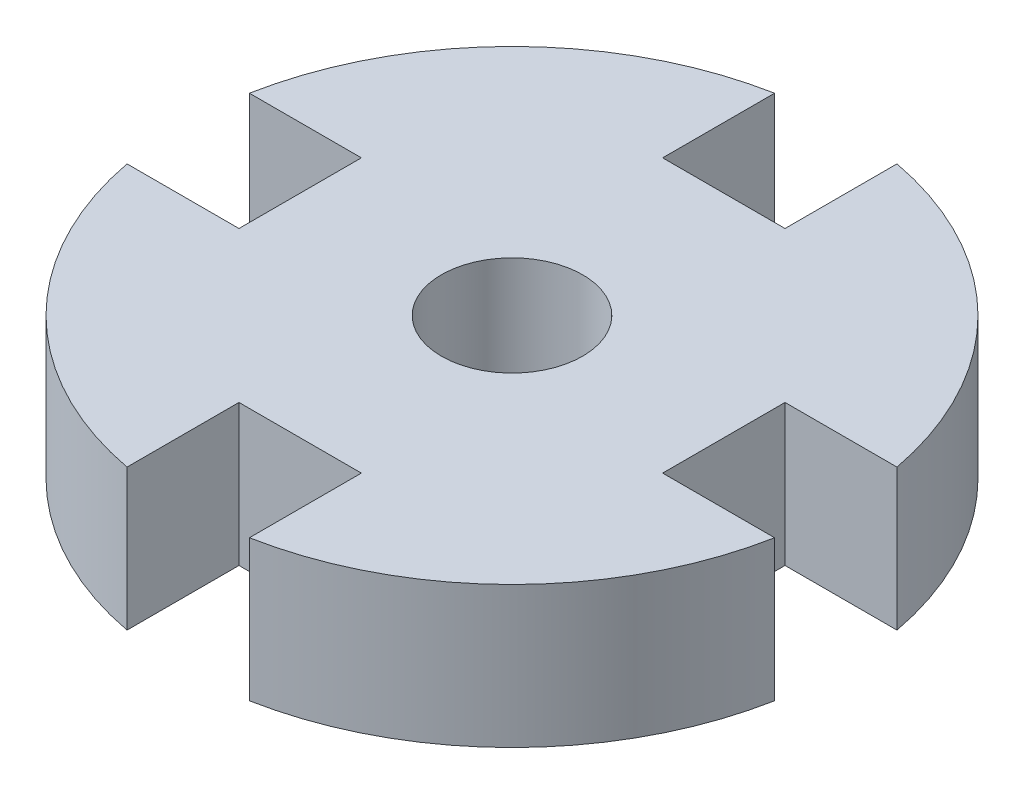
ISO-10303-21;
HEADER;
FILE_DESCRIPTION(('STEP AP214'),'2;1');
FILE_NAME('part.step','',(''),(''),'','','');
FILE_SCHEMA(('AUTOMOTIVE_DESIGN { 1 0 10303 214 1 1 1 1 }'));
ENDSEC;
DATA;
#1=APPLICATION_CONTEXT('core data for automotive mechanical design processes');
#2=APPLICATION_PROTOCOL_DEFINITION('international standard','automotive_design',2000,#1);
#3=PRODUCT_CONTEXT('',#1,'mechanical');
#4=PRODUCT('Part','Part','',(#3));
#5=PRODUCT_RELATED_PRODUCT_CATEGORY('part','',(#4));
#6=PRODUCT_DEFINITION_FORMATION('','',#4);
#7=PRODUCT_DEFINITION_CONTEXT('part definition',#1,'design');
#8=PRODUCT_DEFINITION('design','',#6,#7);
#9=PRODUCT_DEFINITION_SHAPE('','',#8);
#10=(LENGTH_UNIT() NAMED_UNIT(*) SI_UNIT(.MILLI.,.METRE.));
#11=(NAMED_UNIT(*) PLANE_ANGLE_UNIT() SI_UNIT($,.RADIAN.));
#12=(NAMED_UNIT(*) SI_UNIT($,.STERADIAN.) SOLID_ANGLE_UNIT());
#13=UNCERTAINTY_MEASURE_WITH_UNIT(LENGTH_MEASURE(1.E-05),#10,'distance_accuracy_value','');
#14=(GEOMETRIC_REPRESENTATION_CONTEXT(3) GLOBAL_UNCERTAINTY_ASSIGNED_CONTEXT((#13)) GLOBAL_UNIT_ASSIGNED_CONTEXT((#10,
#11,#12)) REPRESENTATION_CONTEXT('',''));
#15=CARTESIAN_POINT('',(0.,0.,0.));
#16=DIRECTION('',(0.,0.,1.));
#17=DIRECTION('',(1.,0.,0.));
#18=AXIS2_PLACEMENT_3D('',#15,#16,#17);
#19=CARTESIAN_POINT('',(0.,-1.5,0.));
#20=DIRECTION('',(0.,1.,0.));
#21=DIRECTION('',(0.,0.,1.));
#22=AXIS2_PLACEMENT_3D('',#19,#20,#21);
#23=CYLINDRICAL_SURFACE('',#22,7.);
#24=DIRECTION('',(0.,1.,0.));
#25=VECTOR('',#24,1.);
#26=CARTESIAN_POINT('',(1.29999999999998,-1.5,6.87822651560706));
#27=LINE('',#26,#25);
#28=CARTESIAN_POINT('',(1.29999999999998,-1.5,6.87822651560706));
#29=VERTEX_POINT('',#28);
#30=CARTESIAN_POINT('',(1.29999999999998,1.5,6.87822651560706));
#31=VERTEX_POINT('',#30);
#32=EDGE_CURVE('E218',#29,#31,#27,.T.);
#33=ORIENTED_EDGE('',*,*,#32,.F.);
#34=CARTESIAN_POINT('',(0.,-1.5,0.));
#35=DIRECTION('',(0.,1.,0.));
#36=DIRECTION('',(0.,0.,1.));
#37=AXIS2_PLACEMENT_3D('',#34,#35,#36);
#38=CIRCLE('',#37,7.);
#39=CARTESIAN_POINT('',(6.87822651560706,-1.5,1.3));
#40=VERTEX_POINT('',#39);
#41=EDGE_CURVE('E256',#29,#40,#38,.T.);
#42=ORIENTED_EDGE('',*,*,#41,.T.);
#43=DIRECTION('',(0.,1.,0.));
#44=VECTOR('',#43,1.);
#45=CARTESIAN_POINT('',(6.87822651560706,-1.5,1.3));
#46=LINE('',#45,#44);
#47=CARTESIAN_POINT('',(6.87822651560706,1.5,1.3));
#48=VERTEX_POINT('',#47);
#49=EDGE_CURVE('E238',#48,#40,#46,.F.);
#50=ORIENTED_EDGE('',*,*,#49,.F.);
#51=CARTESIAN_POINT('',(0.,1.5,0.));
#52=DIRECTION('',(0.,1.,0.));
#53=DIRECTION('',(0.,0.,1.));
#54=AXIS2_PLACEMENT_3D('',#51,#52,#53);
#55=CIRCLE('',#54,7.);
#56=EDGE_CURVE('E248',#31,#48,#55,.T.);
#57=ORIENTED_EDGE('',*,*,#56,.F.);
#58=EDGE_LOOP('',(#33,#42,#50,#57));
#59=FACE_BOUND('',#58,.T.);
#60=ADVANCED_FACE('F33',(#59),#23,.T.);
#61=DIRECTION('',(0.,1.,0.));
#62=VECTOR('',#61,1.);
#63=CARTESIAN_POINT('',(-1.30000000000002,-1.5,6.87822651560705));
#64=LINE('',#63,#62);
#65=CARTESIAN_POINT('',(-1.30000000000002,1.5,6.87822651560705));
#66=VERTEX_POINT('',#65);
#67=CARTESIAN_POINT('',(-1.30000000000002,-1.5,6.87822651560705));
#68=VERTEX_POINT('',#67);
#69=EDGE_CURVE('E160',#66,#68,#64,.F.);
#70=ORIENTED_EDGE('',*,*,#69,.F.);
#71=CARTESIAN_POINT('',(-6.87822651560706,1.5,1.3));
#72=VERTEX_POINT('',#71);
#73=EDGE_CURVE('E305',#72,#66,#55,.T.);
#74=ORIENTED_EDGE('',*,*,#73,.F.);
#75=DIRECTION('',(0.,1.,0.));
#76=VECTOR('',#75,1.);
#77=CARTESIAN_POINT('',(-6.87822651560706,-1.5,1.3));
#78=LINE('',#77,#76);
#79=CARTESIAN_POINT('',(-6.87822651560706,-1.5,1.3));
#80=VERTEX_POINT('',#79);
#81=EDGE_CURVE('E215',#80,#72,#78,.T.);
#82=ORIENTED_EDGE('',*,*,#81,.F.);
#83=EDGE_CURVE('E289',#80,#68,#38,.T.);
#84=ORIENTED_EDGE('',*,*,#83,.T.);
#85=EDGE_LOOP('',(#70,#74,#82,#84));
#86=FACE_BOUND('',#85,.T.);
#87=ADVANCED_FACE('F306',(#86),#23,.T.);
#88=DIRECTION('',(0.,1.,0.));
#89=VECTOR('',#88,1.);
#90=CARTESIAN_POINT('',(-6.87822651560706,-1.5,-1.3));
#91=LINE('',#90,#89);
#92=CARTESIAN_POINT('',(-6.87822651560706,1.5,-1.3));
#93=VERTEX_POINT('',#92);
#94=CARTESIAN_POINT('',(-6.87822651560706,-1.5,-1.3));
#95=VERTEX_POINT('',#94);
#96=EDGE_CURVE('E213',#93,#95,#91,.F.);
#97=ORIENTED_EDGE('',*,*,#96,.F.);
#98=CARTESIAN_POINT('',(-1.29999999999993,1.5,-6.87822651560707));
#99=VERTEX_POINT('',#98);
#100=EDGE_CURVE('E253',#99,#93,#55,.T.);
#101=ORIENTED_EDGE('',*,*,#100,.F.);
#102=DIRECTION('',(0.,1.,0.));
#103=VECTOR('',#102,1.);
#104=CARTESIAN_POINT('',(-1.29999999999993,-1.5,-6.87822651560707));
#105=LINE('',#104,#103);
#106=CARTESIAN_POINT('',(-1.29999999999993,-1.5,-6.87822651560707));
#107=VERTEX_POINT('',#106);
#108=EDGE_CURVE('E211',#107,#99,#105,.T.);
#109=ORIENTED_EDGE('',*,*,#108,.F.);
#110=EDGE_CURVE('E261',#107,#95,#38,.T.);
#111=ORIENTED_EDGE('',*,*,#110,.T.);
#112=EDGE_LOOP('',(#97,#101,#109,#111));
#113=FACE_BOUND('',#112,.T.);
#114=ADVANCED_FACE('F286',(#113),#23,.T.);
#115=DIRECTION('',(0.,1.,0.));
#116=VECTOR('',#115,1.);
#117=CARTESIAN_POINT('',(1.30000000000007,-1.5,-6.87822651560704));
#118=LINE('',#117,#116);
#119=CARTESIAN_POINT('',(1.30000000000007,1.5,-6.87822651560704));
#120=VERTEX_POINT('',#119);
#121=CARTESIAN_POINT('',(1.30000000000007,-1.5,-6.87822651560704));
#122=VERTEX_POINT('',#121);
#123=EDGE_CURVE('E174',#120,#122,#118,.F.);
#124=ORIENTED_EDGE('',*,*,#123,.F.);
#125=CARTESIAN_POINT('',(6.87822651560706,1.5,-1.3));
#126=VERTEX_POINT('',#125);
#127=EDGE_CURVE('E249',#126,#120,#55,.T.);
#128=ORIENTED_EDGE('',*,*,#127,.F.);
#129=DIRECTION('',(0.,1.,0.));
#130=VECTOR('',#129,1.);
#131=CARTESIAN_POINT('',(6.87822651560706,-1.5,-1.3));
#132=LINE('',#131,#130);
#133=CARTESIAN_POINT('',(6.87822651560706,-1.5,-1.3));
#134=VERTEX_POINT('',#133);
#135=EDGE_CURVE('E243',#134,#126,#132,.T.);
#136=ORIENTED_EDGE('',*,*,#135,.F.);
#137=EDGE_CURVE('E257',#134,#122,#38,.T.);
#138=ORIENTED_EDGE('',*,*,#137,.T.);
#139=EDGE_LOOP('',(#124,#128,#136,#138));
#140=FACE_BOUND('',#139,.T.);
#141=ADVANCED_FACE('F35',(#140),#23,.T.);
#142=CARTESIAN_POINT('',(0.,-1.5,0.));
#143=DIRECTION('',(0.,1.,0.));
#144=DIRECTION('',(0.,0.,1.));
#145=AXIS2_PLACEMENT_3D('',#142,#143,#144);
#146=PLANE('',#145);
#147=CARTESIAN_POINT('',(0.,-1.5,0.));
#148=DIRECTION('',(0.,1.,0.));
#149=DIRECTION('',(0.,0.,1.));
#150=AXIS2_PLACEMENT_3D('',#147,#148,#149);
#151=CIRCLE('',#150,1.5);
#152=CARTESIAN_POINT('',(0.,-1.5,1.5));
#153=VERTEX_POINT('',#152);
#154=EDGE_CURVE('E252',#153,#153,#151,.T.);
#155=ORIENTED_EDGE('',*,*,#154,.T.);
#156=EDGE_LOOP('',(#155));
#157=FACE_BOUND('',#156,.T.);
#158=ORIENTED_EDGE('',*,*,#41,.F.);
#159=DIRECTION('',(0.,0.,-1.));
#160=VECTOR('',#159,1.);
#161=CARTESIAN_POINT('',(1.29999999999997,-1.5,9.5));
#162=LINE('',#161,#160);
#163=CARTESIAN_POINT('',(1.29999999999998,-1.5,4.5));
#164=VERTEX_POINT('',#163);
#165=EDGE_CURVE('E154',#29,#164,#162,.T.);
#166=ORIENTED_EDGE('',*,*,#165,.T.);
#167=DIRECTION('',(-1.,0.,0.));
#168=VECTOR('',#167,1.);
#169=CARTESIAN_POINT('',(-1.30000000000002,-1.5,4.49999999999999));
#170=LINE('',#169,#168);
#171=CARTESIAN_POINT('',(-1.30000000000002,-1.5,4.49999999999999));
#172=VERTEX_POINT('',#171);
#173=EDGE_CURVE('E149',#164,#172,#170,.T.);
#174=ORIENTED_EDGE('',*,*,#173,.T.);
#175=DIRECTION('',(0.,0.,1.));
#176=VECTOR('',#175,1.);
#177=CARTESIAN_POINT('',(-1.30000000000003,-1.5,9.49999999999999));
#178=LINE('',#177,#176);
#179=EDGE_CURVE('E157',#172,#68,#178,.T.);
#180=ORIENTED_EDGE('',*,*,#179,.T.);
#181=ORIENTED_EDGE('',*,*,#83,.F.);
#182=DIRECTION('',(1.,0.,0.));
#183=VECTOR('',#182,1.);
#184=CARTESIAN_POINT('',(-9.5,-1.5,1.3));
#185=LINE('',#184,#183);
#186=CARTESIAN_POINT('',(-4.5,-1.5,1.3));
#187=VERTEX_POINT('',#186);
#188=EDGE_CURVE('E183',#80,#187,#185,.T.);
#189=ORIENTED_EDGE('',*,*,#188,.T.);
#190=DIRECTION('',(0.,0.,-1.));
#191=VECTOR('',#190,1.);
#192=CARTESIAN_POINT('',(-4.5,-1.5,-1.3));
#193=LINE('',#192,#191);
#194=CARTESIAN_POINT('',(-4.5,-1.5,-1.3));
#195=VERTEX_POINT('',#194);
#196=EDGE_CURVE('E176',#187,#195,#193,.T.);
#197=ORIENTED_EDGE('',*,*,#196,.T.);
#198=DIRECTION('',(-1.,0.,0.));
#199=VECTOR('',#198,1.);
#200=CARTESIAN_POINT('',(-9.5,-1.5,-1.3));
#201=LINE('',#200,#199);
#202=EDGE_CURVE('E179',#195,#95,#201,.T.);
#203=ORIENTED_EDGE('',*,*,#202,.T.);
#204=ORIENTED_EDGE('',*,*,#110,.F.);
#205=DIRECTION('',(0.,0.,1.));
#206=VECTOR('',#205,1.);
#207=CARTESIAN_POINT('',(-1.2999999999999,-1.5,-9.50000000000001));
#208=LINE('',#207,#206);
#209=CARTESIAN_POINT('',(-1.29999999999995,-1.5,-4.50000000000001));
#210=VERTEX_POINT('',#209);
#211=EDGE_CURVE('E199',#107,#210,#208,.T.);
#212=ORIENTED_EDGE('',*,*,#211,.T.);
#213=DIRECTION('',(1.,0.,0.));
#214=VECTOR('',#213,1.);
#215=CARTESIAN_POINT('',(1.30000000000005,-1.5,-4.49999999999998));
#216=LINE('',#215,#214);
#217=CARTESIAN_POINT('',(1.30000000000005,-1.5,-4.49999999999998));
#218=VERTEX_POINT('',#217);
#219=EDGE_CURVE('E192',#210,#218,#216,.T.);
#220=ORIENTED_EDGE('',*,*,#219,.T.);
#221=DIRECTION('',(0.,0.,-1.));
#222=VECTOR('',#221,1.);
#223=CARTESIAN_POINT('',(1.3000000000001,-1.5,-9.49999999999998));
#224=LINE('',#223,#222);
#225=EDGE_CURVE('E195',#218,#122,#224,.T.);
#226=ORIENTED_EDGE('',*,*,#225,.T.);
#227=ORIENTED_EDGE('',*,*,#137,.F.);
#228=DIRECTION('',(-1.,0.,0.));
#229=VECTOR('',#228,1.);
#230=CARTESIAN_POINT('',(9.5,-1.5,-1.3));
#231=LINE('',#230,#229);
#232=CARTESIAN_POINT('',(4.5,-1.5,-1.3));
#233=VERTEX_POINT('',#232);
#234=EDGE_CURVE('E228',#134,#233,#231,.T.);
#235=ORIENTED_EDGE('',*,*,#234,.T.);
#236=DIRECTION('',(0.,0.,1.));
#237=VECTOR('',#236,1.);
#238=CARTESIAN_POINT('',(4.5,-1.5,1.3));
#239=LINE('',#238,#237);
#240=CARTESIAN_POINT('',(4.5,-1.5,1.3));
#241=VERTEX_POINT('',#240);
#242=EDGE_CURVE('E221',#233,#241,#239,.T.);
#243=ORIENTED_EDGE('',*,*,#242,.T.);
#244=DIRECTION('',(1.,0.,0.));
#245=VECTOR('',#244,1.);
#246=CARTESIAN_POINT('',(9.5,-1.5,1.3));
#247=LINE('',#246,#245);
#248=EDGE_CURVE('E224',#241,#40,#247,.T.);
#249=ORIENTED_EDGE('',*,*,#248,.T.);
#250=EDGE_LOOP('',(#158,#166,#174,#180,#181,#189,#197,#203,#204,#212,#220,#226,#227,#235,#243,#249));
#251=FACE_BOUND('',#250,.T.);
#252=ADVANCED_FACE('F166',(#157,#251),#146,.F.);
#253=CARTESIAN_POINT('',(0.,-1.5,0.));
#254=DIRECTION('',(0.,1.,0.));
#255=DIRECTION('',(0.,0.,1.));
#256=AXIS2_PLACEMENT_3D('',#253,#254,#255);
#257=CYLINDRICAL_SURFACE('',#256,1.5);
#258=ORIENTED_EDGE('',*,*,#154,.F.);
#259=EDGE_LOOP('',(#258));
#260=FACE_BOUND('',#259,.T.);
#261=CARTESIAN_POINT('',(0.,1.5,0.));
#262=DIRECTION('',(0.,1.,0.));
#263=DIRECTION('',(0.,0.,1.));
#264=AXIS2_PLACEMENT_3D('',#261,#262,#263);
#265=CIRCLE('',#264,1.5);
#266=CARTESIAN_POINT('',(0.,1.5,1.5));
#267=VERTEX_POINT('',#266);
#268=EDGE_CURVE('E245',#267,#267,#265,.T.);
#269=ORIENTED_EDGE('',*,*,#268,.T.);
#270=EDGE_LOOP('',(#269));
#271=FACE_BOUND('',#270,.T.);
#272=ADVANCED_FACE('F319',(#260,#271),#257,.F.);
#273=CARTESIAN_POINT('',(0.,1.5,0.));
#274=DIRECTION('',(0.,1.,0.));
#275=DIRECTION('',(0.,0.,1.));
#276=AXIS2_PLACEMENT_3D('',#273,#274,#275);
#277=PLANE('',#276);
#278=DIRECTION('',(0.,0.,-1.));
#279=VECTOR('',#278,1.);
#280=CARTESIAN_POINT('',(1.3,1.5,0.));
#281=LINE('',#280,#279);
#282=CARTESIAN_POINT('',(1.29999999999998,1.5,4.5));
#283=VERTEX_POINT('',#282);
#284=EDGE_CURVE('E11',#31,#283,#281,.T.);
#285=ORIENTED_EDGE('',*,*,#284,.F.);
#286=ORIENTED_EDGE('',*,*,#56,.T.);
#287=DIRECTION('',(1.,0.,0.));
#288=VECTOR('',#287,1.);
#289=CARTESIAN_POINT('',(9.5,1.5,1.3));
#290=LINE('',#289,#288);
#291=CARTESIAN_POINT('',(4.5,1.5,1.3));
#292=VERTEX_POINT('',#291);
#293=EDGE_CURVE('E225',#292,#48,#290,.T.);
#294=ORIENTED_EDGE('',*,*,#293,.F.);
#295=DIRECTION('',(0.,0.,1.));
#296=VECTOR('',#295,1.);
#297=CARTESIAN_POINT('',(4.5,1.5,1.3));
#298=LINE('',#297,#296);
#299=CARTESIAN_POINT('',(4.5,1.5,-1.3));
#300=VERTEX_POINT('',#299);
#301=EDGE_CURVE('E220',#300,#292,#298,.T.);
#302=ORIENTED_EDGE('',*,*,#301,.F.);
#303=DIRECTION('',(-1.,0.,0.));
#304=VECTOR('',#303,1.);
#305=CARTESIAN_POINT('',(0.,1.5,-1.3));
#306=LINE('',#305,#304);
#307=EDGE_CURVE('E260',#126,#300,#306,.T.);
#308=ORIENTED_EDGE('',*,*,#307,.F.);
#309=ORIENTED_EDGE('',*,*,#127,.T.);
#310=DIRECTION('',(0.,0.,-1.));
#311=VECTOR('',#310,1.);
#312=CARTESIAN_POINT('',(1.3000000000001,1.5,-9.49999999999998));
#313=LINE('',#312,#311);
#314=CARTESIAN_POINT('',(1.30000000000005,1.5,-4.49999999999998));
#315=VERTEX_POINT('',#314);
#316=EDGE_CURVE('E196',#315,#120,#313,.T.);
#317=ORIENTED_EDGE('',*,*,#316,.F.);
#318=DIRECTION('',(1.,0.,0.));
#319=VECTOR('',#318,1.);
#320=CARTESIAN_POINT('',(1.30000000000005,1.5,-4.49999999999998));
#321=LINE('',#320,#319);
#322=CARTESIAN_POINT('',(-1.29999999999995,1.5,-4.50000000000001));
#323=VERTEX_POINT('',#322);
#324=EDGE_CURVE('E203',#323,#315,#321,.T.);
#325=ORIENTED_EDGE('',*,*,#324,.F.);
#326=DIRECTION('',(0.,0.,1.));
#327=VECTOR('',#326,1.);
#328=CARTESIAN_POINT('',(-1.3,1.5,0.));
#329=LINE('',#328,#327);
#330=EDGE_CURVE('E263',#99,#323,#329,.T.);
#331=ORIENTED_EDGE('',*,*,#330,.F.);
#332=ORIENTED_EDGE('',*,*,#100,.T.);
#333=DIRECTION('',(-1.,0.,0.));
#334=VECTOR('',#333,1.);
#335=CARTESIAN_POINT('',(-9.5,1.5,-1.3));
#336=LINE('',#335,#334);
#337=CARTESIAN_POINT('',(-4.5,1.5,-1.3));
#338=VERTEX_POINT('',#337);
#339=EDGE_CURVE('E180',#338,#93,#336,.T.);
#340=ORIENTED_EDGE('',*,*,#339,.F.);
#341=DIRECTION('',(0.,0.,-1.));
#342=VECTOR('',#341,1.);
#343=CARTESIAN_POINT('',(-4.5,1.5,-1.3));
#344=LINE('',#343,#342);
#345=CARTESIAN_POINT('',(-4.5,1.5,1.3));
#346=VERTEX_POINT('',#345);
#347=EDGE_CURVE('E56',#346,#338,#344,.T.);
#348=ORIENTED_EDGE('',*,*,#347,.F.);
#349=DIRECTION('',(1.,0.,0.));
#350=VECTOR('',#349,1.);
#351=CARTESIAN_POINT('',(0.,1.5,1.3));
#352=LINE('',#351,#350);
#353=EDGE_CURVE('E41',#72,#346,#352,.T.);
#354=ORIENTED_EDGE('',*,*,#353,.F.);
#355=ORIENTED_EDGE('',*,*,#73,.T.);
#356=DIRECTION('',(0.,0.,1.));
#357=VECTOR('',#356,1.);
#358=CARTESIAN_POINT('',(-1.30000000000003,1.5,9.49999999999999));
#359=LINE('',#358,#357);
#360=CARTESIAN_POINT('',(-1.30000000000002,1.5,4.49999999999999));
#361=VERTEX_POINT('',#360);
#362=EDGE_CURVE('E167',#361,#66,#359,.T.);
#363=ORIENTED_EDGE('',*,*,#362,.F.);
#364=DIRECTION('',(-1.,0.,0.));
#365=VECTOR('',#364,1.);
#366=CARTESIAN_POINT('',(-1.30000000000002,1.5,4.49999999999999));
#367=LINE('',#366,#365);
#368=EDGE_CURVE('E48',#283,#361,#367,.T.);
#369=ORIENTED_EDGE('',*,*,#368,.F.);
#370=EDGE_LOOP('',(#285,#286,#294,#302,#308,#309,#317,#325,#331,#332,#340,#348,#354,#355,#363,#369));
#371=FACE_BOUND('',#370,.T.);
#372=ORIENTED_EDGE('',*,*,#268,.F.);
#373=EDGE_LOOP('',(#372));
#374=FACE_BOUND('',#373,.T.);
#375=ADVANCED_FACE('F275',(#371,#374),#277,.T.);
#376=CARTESIAN_POINT('',(4.5,-1.5,1.3));
#377=DIRECTION('',(-1.,0.,0.));
#378=DIRECTION('',(0.,0.,1.));
#379=AXIS2_PLACEMENT_3D('',#376,#377,#378);
#380=PLANE('',#379);
#381=ORIENTED_EDGE('',*,*,#301,.T.);
#382=DIRECTION('',(0.,1.,0.));
#383=VECTOR('',#382,1.);
#384=CARTESIAN_POINT('',(4.5,-1.5,1.3));
#385=LINE('',#384,#383);
#386=EDGE_CURVE('E231',#241,#292,#385,.T.);
#387=ORIENTED_EDGE('',*,*,#386,.F.);
#388=ORIENTED_EDGE('',*,*,#242,.F.);
#389=DIRECTION('',(0.,1.,0.));
#390=VECTOR('',#389,1.);
#391=CARTESIAN_POINT('',(4.5,-1.5,-1.3));
#392=LINE('',#391,#390);
#393=EDGE_CURVE('E235',#233,#300,#392,.T.);
#394=ORIENTED_EDGE('',*,*,#393,.T.);
#395=EDGE_LOOP('',(#381,#387,#388,#394));
#396=FACE_BOUND('',#395,.T.);
#397=ADVANCED_FACE('F302',(#396),#380,.F.);
#398=CARTESIAN_POINT('',(9.5,-1.5,-1.3));
#399=DIRECTION('',(0.,0.,-1.));
#400=DIRECTION('',(-1.,0.,0.));
#401=AXIS2_PLACEMENT_3D('',#398,#399,#400);
#402=PLANE('',#401);
#403=ORIENTED_EDGE('',*,*,#135,.T.);
#404=ORIENTED_EDGE('',*,*,#307,.T.);
#405=ORIENTED_EDGE('',*,*,#393,.F.);
#406=ORIENTED_EDGE('',*,*,#234,.F.);
#407=EDGE_LOOP('',(#403,#404,#405,#406));
#408=FACE_BOUND('',#407,.T.);
#409=ADVANCED_FACE('F329',(#408),#402,.F.);
#410=CARTESIAN_POINT('',(9.5,-1.5,1.3));
#411=DIRECTION('',(0.,0.,1.));
#412=DIRECTION('',(1.,0.,0.));
#413=AXIS2_PLACEMENT_3D('',#410,#411,#412);
#414=PLANE('',#413);
#415=ORIENTED_EDGE('',*,*,#49,.T.);
#416=ORIENTED_EDGE('',*,*,#248,.F.);
#417=ORIENTED_EDGE('',*,*,#386,.T.);
#418=ORIENTED_EDGE('',*,*,#293,.T.);
#419=EDGE_LOOP('',(#415,#416,#417,#418));
#420=FACE_BOUND('',#419,.T.);
#421=ADVANCED_FACE('F297',(#420),#414,.F.);
#422=CARTESIAN_POINT('',(1.30000000000005,-1.5,-4.49999999999998));
#423=DIRECTION('',(0.,0.,1.));
#424=DIRECTION('',(1.,0.,0.));
#425=AXIS2_PLACEMENT_3D('',#422,#423,#424);
#426=PLANE('',#425);
#427=ORIENTED_EDGE('',*,*,#324,.T.);
#428=DIRECTION('',(0.,1.,0.));
#429=VECTOR('',#428,1.);
#430=CARTESIAN_POINT('',(1.30000000000005,-1.5,-4.49999999999998));
#431=LINE('',#430,#429);
#432=EDGE_CURVE('E202',#218,#315,#431,.T.);
#433=ORIENTED_EDGE('',*,*,#432,.F.);
#434=ORIENTED_EDGE('',*,*,#219,.F.);
#435=DIRECTION('',(0.,1.,0.));
#436=VECTOR('',#435,1.);
#437=CARTESIAN_POINT('',(-1.29999999999995,-1.5,-4.50000000000001));
#438=LINE('',#437,#436);
#439=EDGE_CURVE('E188',#210,#323,#438,.T.);
#440=ORIENTED_EDGE('',*,*,#439,.T.);
#441=EDGE_LOOP('',(#427,#433,#434,#440));
#442=FACE_BOUND('',#441,.T.);
#443=ADVANCED_FACE('F333',(#442),#426,.F.);
#444=CARTESIAN_POINT('',(-1.2999999999999,-1.5,-9.50000000000001));
#445=DIRECTION('',(-1.,0.,0.));
#446=DIRECTION('',(0.,0.,1.));
#447=AXIS2_PLACEMENT_3D('',#444,#445,#446);
#448=PLANE('',#447);
#449=ORIENTED_EDGE('',*,*,#108,.T.);
#450=ORIENTED_EDGE('',*,*,#330,.T.);
#451=ORIENTED_EDGE('',*,*,#439,.F.);
#452=ORIENTED_EDGE('',*,*,#211,.F.);
#453=EDGE_LOOP('',(#449,#450,#451,#452));
#454=FACE_BOUND('',#453,.T.);
#455=ADVANCED_FACE('F335',(#454),#448,.F.);
#456=CARTESIAN_POINT('',(1.3000000000001,-1.5,-9.49999999999998));
#457=DIRECTION('',(1.,0.,0.));
#458=DIRECTION('',(0.,0.,-1.));
#459=AXIS2_PLACEMENT_3D('',#456,#457,#458);
#460=PLANE('',#459);
#461=ORIENTED_EDGE('',*,*,#123,.T.);
#462=ORIENTED_EDGE('',*,*,#225,.F.);
#463=ORIENTED_EDGE('',*,*,#432,.T.);
#464=ORIENTED_EDGE('',*,*,#316,.T.);
#465=EDGE_LOOP('',(#461,#462,#463,#464));
#466=FACE_BOUND('',#465,.T.);
#467=ADVANCED_FACE('F331',(#466),#460,.F.);
#468=CARTESIAN_POINT('',(-4.5,-1.5,-1.3));
#469=DIRECTION('',(1.,0.,0.));
#470=DIRECTION('',(0.,0.,-1.));
#471=AXIS2_PLACEMENT_3D('',#468,#469,#470);
#472=PLANE('',#471);
#473=ORIENTED_EDGE('',*,*,#347,.T.);
#474=DIRECTION('',(0.,1.,0.));
#475=VECTOR('',#474,1.);
#476=CARTESIAN_POINT('',(-4.5,-1.5,-1.3));
#477=LINE('',#476,#475);
#478=EDGE_CURVE('E186',#195,#338,#477,.T.);
#479=ORIENTED_EDGE('',*,*,#478,.F.);
#480=ORIENTED_EDGE('',*,*,#196,.F.);
#481=DIRECTION('',(0.,1.,0.));
#482=VECTOR('',#481,1.);
#483=CARTESIAN_POINT('',(-4.5,-1.5,1.3));
#484=LINE('',#483,#482);
#485=EDGE_CURVE('E172',#187,#346,#484,.T.);
#486=ORIENTED_EDGE('',*,*,#485,.T.);
#487=EDGE_LOOP('',(#473,#479,#480,#486));
#488=FACE_BOUND('',#487,.T.);
#489=ADVANCED_FACE('F272',(#488),#472,.F.);
#490=CARTESIAN_POINT('',(-9.5,-1.5,1.3));
#491=DIRECTION('',(0.,0.,1.));
#492=DIRECTION('',(1.,0.,0.));
#493=AXIS2_PLACEMENT_3D('',#490,#491,#492);
#494=PLANE('',#493);
#495=ORIENTED_EDGE('',*,*,#81,.T.);
#496=ORIENTED_EDGE('',*,*,#353,.T.);
#497=ORIENTED_EDGE('',*,*,#485,.F.);
#498=ORIENTED_EDGE('',*,*,#188,.F.);
#499=EDGE_LOOP('',(#495,#496,#497,#498));
#500=FACE_BOUND('',#499,.T.);
#501=ADVANCED_FACE('F266',(#500),#494,.F.);
#502=CARTESIAN_POINT('',(-9.5,-1.5,-1.3));
#503=DIRECTION('',(0.,0.,-1.));
#504=DIRECTION('',(-1.,0.,0.));
#505=AXIS2_PLACEMENT_3D('',#502,#503,#504);
#506=PLANE('',#505);
#507=ORIENTED_EDGE('',*,*,#96,.T.);
#508=ORIENTED_EDGE('',*,*,#202,.F.);
#509=ORIENTED_EDGE('',*,*,#478,.T.);
#510=ORIENTED_EDGE('',*,*,#339,.T.);
#511=EDGE_LOOP('',(#507,#508,#509,#510));
#512=FACE_BOUND('',#511,.T.);
#513=ADVANCED_FACE('F282',(#512),#506,.F.);
#514=CARTESIAN_POINT('',(-1.30000000000002,-1.5,4.49999999999999));
#515=DIRECTION('',(0.,0.,-1.));
#516=DIRECTION('',(-1.,0.,0.));
#517=AXIS2_PLACEMENT_3D('',#514,#515,#516);
#518=PLANE('',#517);
#519=ORIENTED_EDGE('',*,*,#368,.T.);
#520=DIRECTION('',(0.,1.,0.));
#521=VECTOR('',#520,1.);
#522=CARTESIAN_POINT('',(-1.30000000000002,-1.5,4.49999999999999));
#523=LINE('',#522,#521);
#524=EDGE_CURVE('E145',#172,#361,#523,.T.);
#525=ORIENTED_EDGE('',*,*,#524,.F.);
#526=ORIENTED_EDGE('',*,*,#173,.F.);
#527=DIRECTION('',(0.,1.,0.));
#528=VECTOR('',#527,1.);
#529=CARTESIAN_POINT('',(1.29999999999998,-1.5,4.5));
#530=LINE('',#529,#528);
#531=EDGE_CURVE('E153',#164,#283,#530,.T.);
#532=ORIENTED_EDGE('',*,*,#531,.T.);
#533=EDGE_LOOP('',(#519,#525,#526,#532));
#534=FACE_BOUND('',#533,.T.);
#535=ADVANCED_FACE('F147',(#534),#518,.F.);
#536=CARTESIAN_POINT('',(1.29999999999997,-1.5,9.5));
#537=DIRECTION('',(1.,0.,0.));
#538=DIRECTION('',(0.,0.,-1.));
#539=AXIS2_PLACEMENT_3D('',#536,#537,#538);
#540=PLANE('',#539);
#541=ORIENTED_EDGE('',*,*,#32,.T.);
#542=ORIENTED_EDGE('',*,*,#284,.T.);
#543=ORIENTED_EDGE('',*,*,#531,.F.);
#544=ORIENTED_EDGE('',*,*,#165,.F.);
#545=EDGE_LOOP('',(#541,#542,#543,#544));
#546=FACE_BOUND('',#545,.T.);
#547=ADVANCED_FACE('F426',(#546),#540,.F.);
#548=CARTESIAN_POINT('',(-1.30000000000003,-1.5,9.49999999999999));
#549=DIRECTION('',(-1.,0.,0.));
#550=DIRECTION('',(0.,0.,1.));
#551=AXIS2_PLACEMENT_3D('',#548,#549,#550);
#552=PLANE('',#551);
#553=ORIENTED_EDGE('',*,*,#69,.T.);
#554=ORIENTED_EDGE('',*,*,#179,.F.);
#555=ORIENTED_EDGE('',*,*,#524,.T.);
#556=ORIENTED_EDGE('',*,*,#362,.T.);
#557=EDGE_LOOP('',(#553,#554,#555,#556));
#558=FACE_BOUND('',#557,.T.);
#559=ADVANCED_FACE('F158',(#558),#552,.F.);
#560=CLOSED_SHELL('',(#60,#87,#114,#141,#252,#272,#375,#397,#409,#421,#443,#455,#467,#489,#501,
#513,#535,#547,#559));
#561=MANIFOLD_SOLID_BREP('B2',#560);
#562=ADVANCED_BREP_SHAPE_REPRESENTATION('',(#18,#561),#14);
#563=SHAPE_DEFINITION_REPRESENTATION(#9,#562);
ENDSEC;
END-ISO-10303-21;
